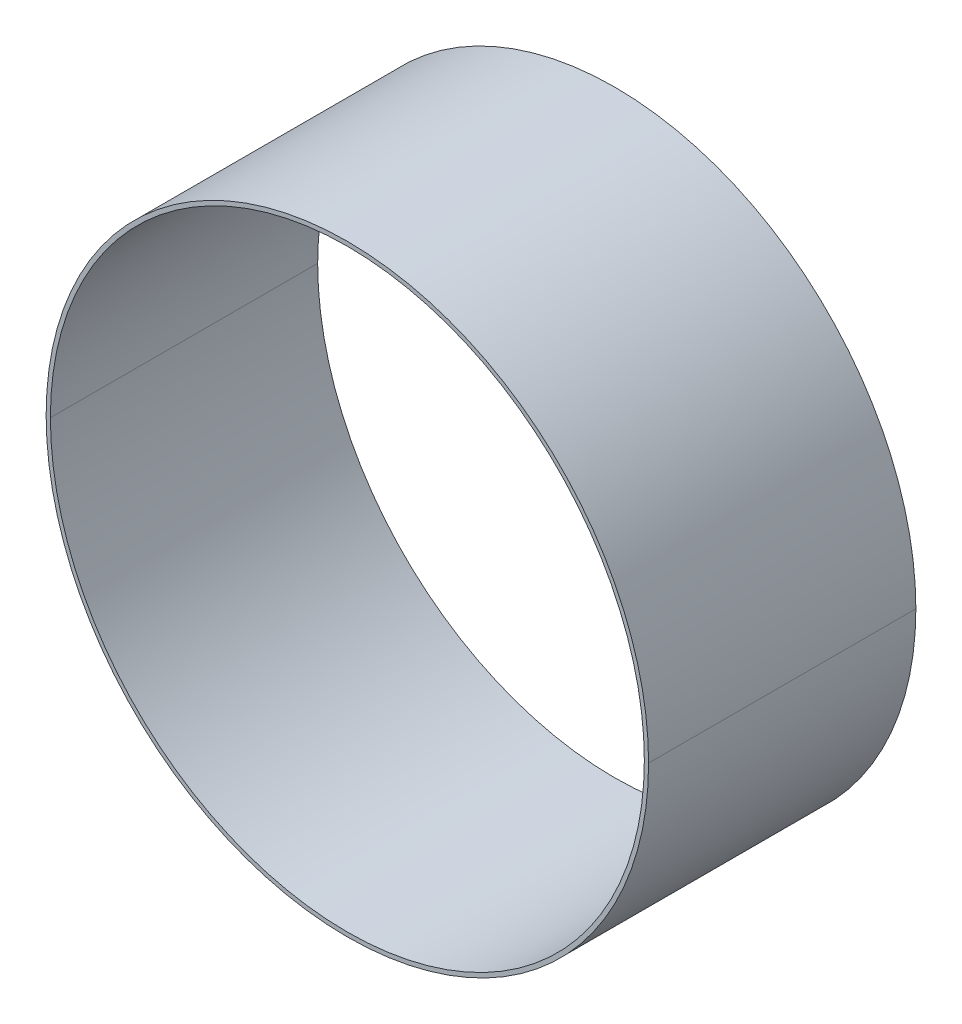
ISO-10303-21;
HEADER;
FILE_DESCRIPTION(('STEP AP214'),'2;1');
FILE_NAME('part.step','',(''),(''),'','','');
FILE_SCHEMA(('AUTOMOTIVE_DESIGN { 1 0 10303 214 1 1 1 1 }'));
ENDSEC;
DATA;
#1=APPLICATION_CONTEXT('core data for automotive mechanical design processes');
#2=APPLICATION_PROTOCOL_DEFINITION('international standard','automotive_design',2000,#1);
#3=PRODUCT_CONTEXT('',#1,'mechanical');
#4=PRODUCT('Part','Part','',(#3));
#5=PRODUCT_RELATED_PRODUCT_CATEGORY('part','',(#4));
#6=PRODUCT_DEFINITION_FORMATION('','',#4);
#7=PRODUCT_DEFINITION_CONTEXT('part definition',#1,'design');
#8=PRODUCT_DEFINITION('design','',#6,#7);
#9=PRODUCT_DEFINITION_SHAPE('','',#8);
#10=(LENGTH_UNIT() NAMED_UNIT(*) SI_UNIT(.MILLI.,.METRE.));
#11=(NAMED_UNIT(*) PLANE_ANGLE_UNIT() SI_UNIT($,.RADIAN.));
#12=(NAMED_UNIT(*) SI_UNIT($,.STERADIAN.) SOLID_ANGLE_UNIT());
#13=UNCERTAINTY_MEASURE_WITH_UNIT(LENGTH_MEASURE(1.E-05),#10,'distance_accuracy_value','');
#14=(GEOMETRIC_REPRESENTATION_CONTEXT(3) GLOBAL_UNCERTAINTY_ASSIGNED_CONTEXT((#13)) GLOBAL_UNIT_ASSIGNED_CONTEXT((#10,
#11,#12)) REPRESENTATION_CONTEXT('',''));
#15=CARTESIAN_POINT('',(0.,0.,0.));
#16=DIRECTION('',(0.,0.,1.));
#17=DIRECTION('',(1.,0.,0.));
#18=AXIS2_PLACEMENT_3D('',#15,#16,#17);
#19=CARTESIAN_POINT('',(0.,0.,63.));
#20=DIRECTION('',(0.,0.,-1.));
#21=DIRECTION('',(-1.,0.,0.));
#22=AXIS2_PLACEMENT_3D('',#19,#20,#21);
#23=CYLINDRICAL_SURFACE('',#22,70.);
#24=DIRECTION('',(0.,0.,-1.));
#25=VECTOR('',#24,1.);
#26=CARTESIAN_POINT('',(70.,0.,63.));
#27=LINE('',#26,#25);
#28=CARTESIAN_POINT('',(70.,0.,63.));
#29=VERTEX_POINT('',#28);
#30=CARTESIAN_POINT('',(70.,0.,0.));
#31=VERTEX_POINT('',#30);
#32=EDGE_CURVE('E83',#29,#31,#27,.T.);
#33=ORIENTED_EDGE('',*,*,#32,.F.);
#34=CARTESIAN_POINT('',(0.,0.,63.));
#35=DIRECTION('',(0.,0.,1.));
#36=DIRECTION('',(1.,0.,0.));
#37=AXIS2_PLACEMENT_3D('',#34,#35,#36);
#38=CIRCLE('',#37,70.);
#39=CARTESIAN_POINT('',(-70.,0.,63.));
#40=VERTEX_POINT('',#39);
#41=EDGE_CURVE('E102',#29,#40,#38,.T.);
#42=ORIENTED_EDGE('',*,*,#41,.T.);
#43=DIRECTION('',(0.,0.,-1.));
#44=VECTOR('',#43,1.);
#45=CARTESIAN_POINT('',(-70.,0.,63.));
#46=LINE('',#45,#44);
#47=CARTESIAN_POINT('',(-70.,0.,0.));
#48=VERTEX_POINT('',#47);
#49=EDGE_CURVE('E20',#40,#48,#46,.T.);
#50=ORIENTED_EDGE('',*,*,#49,.T.);
#51=CARTESIAN_POINT('',(0.,0.,0.));
#52=DIRECTION('',(0.,0.,1.));
#53=DIRECTION('',(1.,0.,0.));
#54=AXIS2_PLACEMENT_3D('',#51,#52,#53);
#55=CIRCLE('',#54,70.);
#56=EDGE_CURVE('E11',#31,#48,#55,.T.);
#57=ORIENTED_EDGE('',*,*,#56,.F.);
#58=EDGE_LOOP('',(#33,#42,#50,#57));
#59=FACE_BOUND('',#58,.T.);
#60=ADVANCED_FACE('F16',(#59),#23,.F.);
#61=CARTESIAN_POINT('',(0.,0.,63.));
#62=DIRECTION('',(0.,0.,-1.));
#63=DIRECTION('',(-1.,0.,0.));
#64=AXIS2_PLACEMENT_3D('',#61,#62,#63);
#65=CYLINDRICAL_SURFACE('',#64,71.);
#66=DIRECTION('',(0.,0.,-1.));
#67=VECTOR('',#66,1.);
#68=CARTESIAN_POINT('',(71.,0.,63.));
#69=LINE('',#68,#67);
#70=CARTESIAN_POINT('',(71.,0.,63.));
#71=VERTEX_POINT('',#70);
#72=CARTESIAN_POINT('',(71.,0.,0.));
#73=VERTEX_POINT('',#72);
#74=EDGE_CURVE('E106',#71,#73,#69,.T.);
#75=ORIENTED_EDGE('',*,*,#74,.F.);
#76=CARTESIAN_POINT('',(0.,0.,63.));
#77=DIRECTION('',(0.,0.,1.));
#78=DIRECTION('',(1.,0.,0.));
#79=AXIS2_PLACEMENT_3D('',#76,#77,#78);
#80=CIRCLE('',#79,71.);
#81=CARTESIAN_POINT('',(-71.,0.,63.));
#82=VERTEX_POINT('',#81);
#83=EDGE_CURVE('E69',#82,#71,#80,.T.);
#84=ORIENTED_EDGE('',*,*,#83,.F.);
#85=DIRECTION('',(0.,0.,-1.));
#86=VECTOR('',#85,1.);
#87=CARTESIAN_POINT('',(-71.,0.,63.));
#88=LINE('',#87,#86);
#89=CARTESIAN_POINT('',(-71.,0.,0.));
#90=VERTEX_POINT('',#89);
#91=EDGE_CURVE('E114',#82,#90,#88,.T.);
#92=ORIENTED_EDGE('',*,*,#91,.T.);
#93=CARTESIAN_POINT('',(0.,0.,0.));
#94=DIRECTION('',(0.,0.,1.));
#95=DIRECTION('',(1.,0.,0.));
#96=AXIS2_PLACEMENT_3D('',#93,#94,#95);
#97=CIRCLE('',#96,71.);
#98=EDGE_CURVE('E26',#90,#73,#97,.T.);
#99=ORIENTED_EDGE('',*,*,#98,.T.);
#100=EDGE_LOOP('',(#75,#84,#92,#99));
#101=FACE_BOUND('',#100,.T.);
#102=ADVANCED_FACE('F123',(#101),#65,.T.);
#103=CARTESIAN_POINT('',(0.,0.,0.));
#104=DIRECTION('',(0.,0.,1.));
#105=DIRECTION('',(1.,0.,0.));
#106=AXIS2_PLACEMENT_3D('',#103,#104,#105);
#107=PLANE('',#106);
#108=CARTESIAN_POINT('',(0.,0.,0.));
#109=DIRECTION('',(0.,0.,1.));
#110=DIRECTION('',(1.,0.,0.));
#111=AXIS2_PLACEMENT_3D('',#108,#109,#110);
#112=CIRCLE('',#111,70.);
#113=EDGE_CURVE('E87',#48,#31,#112,.T.);
#114=ORIENTED_EDGE('',*,*,#113,.T.);
#115=ORIENTED_EDGE('',*,*,#56,.T.);
#116=EDGE_LOOP('',(#114,#115));
#117=FACE_BOUND('',#116,.T.);
#118=ORIENTED_EDGE('',*,*,#98,.F.);
#119=CARTESIAN_POINT('',(0.,0.,0.));
#120=DIRECTION('',(0.,0.,1.));
#121=DIRECTION('',(1.,0.,0.));
#122=AXIS2_PLACEMENT_3D('',#119,#120,#121);
#123=CIRCLE('',#122,71.);
#124=EDGE_CURVE('E109',#73,#90,#123,.T.);
#125=ORIENTED_EDGE('',*,*,#124,.F.);
#126=EDGE_LOOP('',(#118,#125));
#127=FACE_BOUND('',#126,.T.);
#128=ADVANCED_FACE('F88',(#117,#127),#107,.F.);
#129=CARTESIAN_POINT('',(0.,0.,63.));
#130=DIRECTION('',(0.,0.,1.));
#131=DIRECTION('',(1.,0.,0.));
#132=AXIS2_PLACEMENT_3D('',#129,#130,#131);
#133=PLANE('',#132);
#134=CARTESIAN_POINT('',(0.,0.,63.));
#135=DIRECTION('',(0.,0.,1.));
#136=DIRECTION('',(1.,0.,0.));
#137=AXIS2_PLACEMENT_3D('',#134,#135,#136);
#138=CIRCLE('',#137,70.);
#139=EDGE_CURVE('E92',#40,#29,#138,.T.);
#140=ORIENTED_EDGE('',*,*,#139,.F.);
#141=ORIENTED_EDGE('',*,*,#41,.F.);
#142=EDGE_LOOP('',(#140,#141));
#143=FACE_BOUND('',#142,.T.);
#144=ORIENTED_EDGE('',*,*,#83,.T.);
#145=CARTESIAN_POINT('',(0.,0.,63.));
#146=DIRECTION('',(0.,0.,1.));
#147=DIRECTION('',(1.,0.,0.));
#148=AXIS2_PLACEMENT_3D('',#145,#146,#147);
#149=CIRCLE('',#148,71.);
#150=EDGE_CURVE('E103',#71,#82,#149,.T.);
#151=ORIENTED_EDGE('',*,*,#150,.T.);
#152=EDGE_LOOP('',(#144,#151));
#153=FACE_BOUND('',#152,.T.);
#154=ADVANCED_FACE('F128',(#143,#153),#133,.T.);
#155=CARTESIAN_POINT('',(0.,0.,63.));
#156=DIRECTION('',(0.,0.,-1.));
#157=DIRECTION('',(-1.,0.,0.));
#158=AXIS2_PLACEMENT_3D('',#155,#156,#157);
#159=CYLINDRICAL_SURFACE('',#158,71.);
#160=ORIENTED_EDGE('',*,*,#150,.F.);
#161=ORIENTED_EDGE('',*,*,#74,.T.);
#162=ORIENTED_EDGE('',*,*,#124,.T.);
#163=ORIENTED_EDGE('',*,*,#91,.F.);
#164=EDGE_LOOP('',(#160,#161,#162,#163));
#165=FACE_BOUND('',#164,.T.);
#166=ADVANCED_FACE('F126',(#165),#159,.T.);
#167=CARTESIAN_POINT('',(0.,0.,63.));
#168=DIRECTION('',(0.,0.,-1.));
#169=DIRECTION('',(-1.,0.,0.));
#170=AXIS2_PLACEMENT_3D('',#167,#168,#169);
#171=CYLINDRICAL_SURFACE('',#170,70.);
#172=ORIENTED_EDGE('',*,*,#139,.T.);
#173=ORIENTED_EDGE('',*,*,#32,.T.);
#174=ORIENTED_EDGE('',*,*,#113,.F.);
#175=ORIENTED_EDGE('',*,*,#49,.F.);
#176=EDGE_LOOP('',(#172,#173,#174,#175));
#177=FACE_BOUND('',#176,.T.);
#178=ADVANCED_FACE('F18',(#177),#171,.F.);
#179=CLOSED_SHELL('',(#60,#102,#128,#154,#166,#178));
#180=MANIFOLD_SOLID_BREP('B1',#179);
#181=ADVANCED_BREP_SHAPE_REPRESENTATION('',(#18,#180),#14);
#182=SHAPE_DEFINITION_REPRESENTATION(#9,#181);
ENDSEC;
END-ISO-10303-21;
